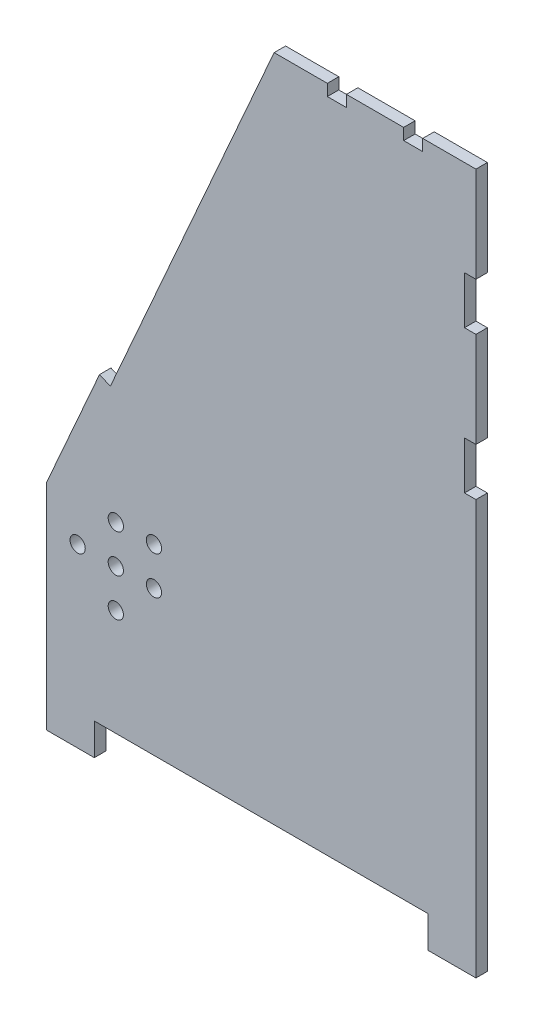
ISO-10303-21;
HEADER;
FILE_DESCRIPTION(('STEP AP214'),'2;1');
FILE_NAME('part.step','',(''),(''),'','','');
FILE_SCHEMA(('AUTOMOTIVE_DESIGN { 1 0 10303 214 1 1 1 1 }'));
ENDSEC;
DATA;
#1=APPLICATION_CONTEXT('core data for automotive mechanical design processes');
#2=APPLICATION_PROTOCOL_DEFINITION('international standard','automotive_design',2000,#1);
#3=PRODUCT_CONTEXT('',#1,'mechanical');
#4=PRODUCT('Part','Part','',(#3));
#5=PRODUCT_RELATED_PRODUCT_CATEGORY('part','',(#4));
#6=PRODUCT_DEFINITION_FORMATION('','',#4);
#7=PRODUCT_DEFINITION_CONTEXT('part definition',#1,'design');
#8=PRODUCT_DEFINITION('design','',#6,#7);
#9=PRODUCT_DEFINITION_SHAPE('','',#8);
#10=(LENGTH_UNIT() NAMED_UNIT(*) SI_UNIT(.MILLI.,.METRE.));
#11=(NAMED_UNIT(*) PLANE_ANGLE_UNIT() SI_UNIT($,.RADIAN.));
#12=(NAMED_UNIT(*) SI_UNIT($,.STERADIAN.) SOLID_ANGLE_UNIT());
#13=UNCERTAINTY_MEASURE_WITH_UNIT(LENGTH_MEASURE(1.E-05),#10,'distance_accuracy_value','');
#14=(GEOMETRIC_REPRESENTATION_CONTEXT(3) GLOBAL_UNCERTAINTY_ASSIGNED_CONTEXT((#13)) GLOBAL_UNIT_ASSIGNED_CONTEXT((#10,
#11,#12)) REPRESENTATION_CONTEXT('',''));
#15=CARTESIAN_POINT('',(0.,0.,0.));
#16=DIRECTION('',(0.,0.,1.));
#17=DIRECTION('',(1.,0.,0.));
#18=AXIS2_PLACEMENT_3D('',#15,#16,#17);
#19=CARTESIAN_POINT('',(-43.1964557488303,19.0826041733589,2.4));
#20=DIRECTION('',(-0.914719494610713,0.404089403695669,0.));
#21=DIRECTION('',(-0.404089403695669,-0.914719494610713,0.));
#22=AXIS2_PLACEMENT_3D('',#19,#20,#21);
#23=PLANE('',#22);
#24=DIRECTION('',(0.404089403695669,0.914719494610713,0.));
#25=VECTOR('',#24,1.);
#26=CARTESIAN_POINT('',(-43.1964557488303,19.0826041733589,0.));
#27=LINE('',#26,#25);
#28=CARTESIAN_POINT('',(-45.,15.,0.));
#29=VERTEX_POINT('',#28);
#30=CARTESIAN_POINT('',(-33.9067210494482,40.1113699652133,0.));
#31=VERTEX_POINT('',#30);
#32=EDGE_CURVE('E267',#29,#31,#27,.T.);
#33=ORIENTED_EDGE('',*,*,#32,.F.);
#34=DIRECTION('',(0.,0.,-1.));
#35=VECTOR('',#34,1.);
#36=CARTESIAN_POINT('',(-45.,15.,2.4));
#37=LINE('',#36,#35);
#38=CARTESIAN_POINT('',(-45.,15.,2.4));
#39=VERTEX_POINT('',#38);
#40=EDGE_CURVE('E11',#39,#29,#37,.T.);
#41=ORIENTED_EDGE('',*,*,#40,.F.);
#42=DIRECTION('',(0.404089403695669,0.914719494610713,0.));
#43=VECTOR('',#42,1.);
#44=CARTESIAN_POINT('',(-43.1964557488303,19.0826041733589,2.4));
#45=LINE('',#44,#43);
#46=CARTESIAN_POINT('',(-33.9067210494482,40.1113699652133,2.4));
#47=VERTEX_POINT('',#46);
#48=EDGE_CURVE('E409',#39,#47,#45,.T.);
#49=ORIENTED_EDGE('',*,*,#48,.T.);
#50=DIRECTION('',(0.,0.,-1.));
#51=VECTOR('',#50,1.);
#52=CARTESIAN_POINT('',(-33.9067210494482,40.1113699652133,2.4));
#53=LINE('',#52,#51);
#54=EDGE_CURVE('E146',#47,#31,#53,.T.);
#55=ORIENTED_EDGE('',*,*,#54,.T.);
#56=EDGE_LOOP('',(#33,#41,#49,#55));
#57=FACE_BOUND('',#56,.T.);
#58=ADVANCED_FACE('F37',(#57),#23,.T.);
#59=CARTESIAN_POINT('',(-45.,0.,2.4));
#60=DIRECTION('',(1.,0.,0.));
#61=DIRECTION('',(0.,1.,0.));
#62=AXIS2_PLACEMENT_3D('',#59,#60,#61);
#63=PLANE('',#62);
#64=DIRECTION('',(0.,-1.,0.));
#65=VECTOR('',#64,1.);
#66=CARTESIAN_POINT('',(-45.,0.,0.));
#67=LINE('',#66,#65);
#68=CARTESIAN_POINT('',(-45.,-30.,0.));
#69=VERTEX_POINT('',#68);
#70=EDGE_CURVE('E269',#29,#69,#67,.T.);
#71=ORIENTED_EDGE('',*,*,#70,.T.);
#72=DIRECTION('',(0.,0.,-1.));
#73=VECTOR('',#72,1.);
#74=CARTESIAN_POINT('',(-45.,-30.,2.4));
#75=LINE('',#74,#73);
#76=CARTESIAN_POINT('',(-45.,-30.,2.4));
#77=VERTEX_POINT('',#76);
#78=EDGE_CURVE('E46',#77,#69,#75,.T.);
#79=ORIENTED_EDGE('',*,*,#78,.F.);
#80=DIRECTION('',(0.,-1.,0.));
#81=VECTOR('',#80,1.);
#82=CARTESIAN_POINT('',(-45.,0.,2.4));
#83=LINE('',#82,#81);
#84=EDGE_CURVE('E406',#39,#77,#83,.T.);
#85=ORIENTED_EDGE('',*,*,#84,.F.);
#86=ORIENTED_EDGE('',*,*,#40,.T.);
#87=EDGE_LOOP('',(#71,#79,#85,#86));
#88=FACE_BOUND('',#87,.T.);
#89=ADVANCED_FACE('F394',(#88),#63,.F.);
#90=CARTESIAN_POINT('',(0.,-30.,2.4));
#91=DIRECTION('',(0.,-1.,0.));
#92=DIRECTION('',(1.,0.,0.));
#93=AXIS2_PLACEMENT_3D('',#90,#91,#92);
#94=PLANE('',#93);
#95=DIRECTION('',(-1.,0.,0.));
#96=VECTOR('',#95,1.);
#97=CARTESIAN_POINT('',(0.,-30.,0.));
#98=LINE('',#97,#96);
#99=CARTESIAN_POINT('',(-35.,-30.,0.));
#100=VERTEX_POINT('',#99);
#101=EDGE_CURVE('E272',#100,#69,#98,.T.);
#102=ORIENTED_EDGE('',*,*,#101,.F.);
#103=DIRECTION('',(0.,0.,-1.));
#104=VECTOR('',#103,1.);
#105=CARTESIAN_POINT('',(-35.,-30.,2.4));
#106=LINE('',#105,#104);
#107=CARTESIAN_POINT('',(-35.,-30.,2.4));
#108=VERTEX_POINT('',#107);
#109=EDGE_CURVE('E384',#108,#100,#106,.T.);
#110=ORIENTED_EDGE('',*,*,#109,.F.);
#111=DIRECTION('',(-1.,0.,0.));
#112=VECTOR('',#111,1.);
#113=CARTESIAN_POINT('',(0.,-30.,2.4));
#114=LINE('',#113,#112);
#115=EDGE_CURVE('E391',#108,#77,#114,.T.);
#116=ORIENTED_EDGE('',*,*,#115,.T.);
#117=ORIENTED_EDGE('',*,*,#78,.T.);
#118=EDGE_LOOP('',(#102,#110,#116,#117));
#119=FACE_BOUND('',#118,.T.);
#120=ADVANCED_FACE('F389',(#119),#94,.T.);
#121=CARTESIAN_POINT('',(-35.,0.,2.4));
#122=DIRECTION('',(-1.,0.,0.));
#123=DIRECTION('',(0.,-1.,0.));
#124=AXIS2_PLACEMENT_3D('',#121,#122,#123);
#125=PLANE('',#124);
#126=DIRECTION('',(0.,1.,0.));
#127=VECTOR('',#126,1.);
#128=CARTESIAN_POINT('',(-35.,0.,0.));
#129=LINE('',#128,#127);
#130=CARTESIAN_POINT('',(-35.,-23.3333333333333,0.));
#131=VERTEX_POINT('',#130);
#132=EDGE_CURVE('E275',#100,#131,#129,.T.);
#133=ORIENTED_EDGE('',*,*,#132,.T.);
#134=DIRECTION('',(0.,0.,-1.));
#135=VECTOR('',#134,1.);
#136=CARTESIAN_POINT('',(-35.,-23.3333333333333,2.4));
#137=LINE('',#136,#135);
#138=CARTESIAN_POINT('',(-35.,-23.3333333333333,2.4));
#139=VERTEX_POINT('',#138);
#140=EDGE_CURVE('E381',#139,#131,#137,.T.);
#141=ORIENTED_EDGE('',*,*,#140,.F.);
#142=DIRECTION('',(0.,1.,0.));
#143=VECTOR('',#142,1.);
#144=CARTESIAN_POINT('',(-35.,0.,2.4));
#145=LINE('',#144,#143);
#146=EDGE_CURVE('E402',#108,#139,#145,.T.);
#147=ORIENTED_EDGE('',*,*,#146,.F.);
#148=ORIENTED_EDGE('',*,*,#109,.T.);
#149=EDGE_LOOP('',(#133,#141,#147,#148));
#150=FACE_BOUND('',#149,.T.);
#151=ADVANCED_FACE('F399',(#150),#125,.F.);
#152=CARTESIAN_POINT('',(0.,-23.3333333333333,2.4));
#153=DIRECTION('',(0.,1.,0.));
#154=DIRECTION('',(0.,0.,1.));
#155=AXIS2_PLACEMENT_3D('',#152,#153,#154);
#156=PLANE('',#155);
#157=DIRECTION('',(1.,0.,0.));
#158=VECTOR('',#157,1.);
#159=CARTESIAN_POINT('',(0.,-23.3333333333333,0.));
#160=LINE('',#159,#158);
#161=CARTESIAN_POINT('',(35.,-23.3333333333333,0.));
#162=VERTEX_POINT('',#161);
#163=EDGE_CURVE('E279',#131,#162,#160,.T.);
#164=ORIENTED_EDGE('',*,*,#163,.T.);
#165=DIRECTION('',(0.,0.,-1.));
#166=VECTOR('',#165,1.);
#167=CARTESIAN_POINT('',(35.,-23.3333333333333,2.4));
#168=LINE('',#167,#166);
#169=CARTESIAN_POINT('',(35.,-23.3333333333333,2.4));
#170=VERTEX_POINT('',#169);
#171=EDGE_CURVE('E378',#170,#162,#168,.T.);
#172=ORIENTED_EDGE('',*,*,#171,.F.);
#173=DIRECTION('',(1.,0.,0.));
#174=VECTOR('',#173,1.);
#175=CARTESIAN_POINT('',(0.,-23.3333333333333,2.4));
#176=LINE('',#175,#174);
#177=EDGE_CURVE('E404',#139,#170,#176,.T.);
#178=ORIENTED_EDGE('',*,*,#177,.F.);
#179=ORIENTED_EDGE('',*,*,#140,.T.);
#180=EDGE_LOOP('',(#164,#172,#178,#179));
#181=FACE_BOUND('',#180,.T.);
#182=ADVANCED_FACE('F536',(#181),#156,.F.);
#183=CARTESIAN_POINT('',(35.,0.,2.4));
#184=DIRECTION('',(1.,0.,0.));
#185=DIRECTION('',(0.,0.,-1.));
#186=AXIS2_PLACEMENT_3D('',#183,#184,#185);
#187=PLANE('',#186);
#188=DIRECTION('',(0.,-1.,0.));
#189=VECTOR('',#188,1.);
#190=CARTESIAN_POINT('',(35.,0.,0.));
#191=LINE('',#190,#189);
#192=CARTESIAN_POINT('',(35.,-30.,0.));
#193=VERTEX_POINT('',#192);
#194=EDGE_CURVE('E282',#162,#193,#191,.T.);
#195=ORIENTED_EDGE('',*,*,#194,.T.);
#196=DIRECTION('',(0.,0.,-1.));
#197=VECTOR('',#196,1.);
#198=CARTESIAN_POINT('',(35.,-30.,2.4));
#199=LINE('',#198,#197);
#200=CARTESIAN_POINT('',(35.,-30.,2.4));
#201=VERTEX_POINT('',#200);
#202=EDGE_CURVE('E376',#201,#193,#199,.T.);
#203=ORIENTED_EDGE('',*,*,#202,.F.);
#204=DIRECTION('',(0.,-1.,0.));
#205=VECTOR('',#204,1.);
#206=CARTESIAN_POINT('',(35.,0.,2.4));
#207=LINE('',#206,#205);
#208=EDGE_CURVE('E413',#170,#201,#207,.T.);
#209=ORIENTED_EDGE('',*,*,#208,.F.);
#210=ORIENTED_EDGE('',*,*,#171,.T.);
#211=EDGE_LOOP('',(#195,#203,#209,#210));
#212=FACE_BOUND('',#211,.T.);
#213=ADVANCED_FACE('F533',(#212),#187,.F.);
#214=CARTESIAN_POINT('',(45.,-30.,0.));
#215=VERTEX_POINT('',#214);
#216=EDGE_CURVE('E276',#215,#193,#98,.T.);
#217=ORIENTED_EDGE('',*,*,#216,.F.);
#218=DIRECTION('',(0.,0.,-1.));
#219=VECTOR('',#218,1.);
#220=CARTESIAN_POINT('',(45.,-30.,2.4));
#221=LINE('',#220,#219);
#222=CARTESIAN_POINT('',(45.,-30.,2.4));
#223=VERTEX_POINT('',#222);
#224=EDGE_CURVE('E374',#223,#215,#221,.T.);
#225=ORIENTED_EDGE('',*,*,#224,.F.);
#226=EDGE_CURVE('E408',#223,#201,#114,.T.);
#227=ORIENTED_EDGE('',*,*,#226,.T.);
#228=ORIENTED_EDGE('',*,*,#202,.T.);
#229=EDGE_LOOP('',(#217,#225,#227,#228));
#230=FACE_BOUND('',#229,.T.);
#231=ADVANCED_FACE('F531',(#230),#94,.T.);
#232=CARTESIAN_POINT('',(45.,0.,2.4));
#233=DIRECTION('',(1.,0.,0.));
#234=DIRECTION('',(0.,0.,-1.));
#235=AXIS2_PLACEMENT_3D('',#232,#233,#234);
#236=PLANE('',#235);
#237=DIRECTION('',(0.,-1.,0.));
#238=VECTOR('',#237,1.);
#239=CARTESIAN_POINT('',(45.,0.,0.));
#240=LINE('',#239,#238);
#241=CARTESIAN_POINT('',(45.,56.8645301782836,0.));
#242=VERTEX_POINT('',#241);
#243=EDGE_CURVE('E285',#242,#215,#240,.T.);
#244=ORIENTED_EDGE('',*,*,#243,.F.);
#245=DIRECTION('',(0.,0.,-1.));
#246=VECTOR('',#245,1.);
#247=CARTESIAN_POINT('',(45.,56.8645301782836,2.4));
#248=LINE('',#247,#246);
#249=CARTESIAN_POINT('',(45.,56.8645301782836,2.4));
#250=VERTEX_POINT('',#249);
#251=EDGE_CURVE('E372',#250,#242,#248,.T.);
#252=ORIENTED_EDGE('',*,*,#251,.F.);
#253=DIRECTION('',(0.,-1.,0.));
#254=VECTOR('',#253,1.);
#255=CARTESIAN_POINT('',(45.,0.,2.4));
#256=LINE('',#255,#254);
#257=EDGE_CURVE('E412',#250,#223,#256,.T.);
#258=ORIENTED_EDGE('',*,*,#257,.T.);
#259=ORIENTED_EDGE('',*,*,#224,.T.);
#260=EDGE_LOOP('',(#244,#252,#258,#259));
#261=FACE_BOUND('',#260,.T.);
#262=ADVANCED_FACE('F529',(#261),#236,.T.);
#263=CARTESIAN_POINT('',(0.,56.8645301782836,2.4));
#264=DIRECTION('',(0.,1.,0.));
#265=DIRECTION('',(0.,0.,1.));
#266=AXIS2_PLACEMENT_3D('',#263,#264,#265);
#267=PLANE('',#266);
#268=DIRECTION('',(1.,0.,0.));
#269=VECTOR('',#268,1.);
#270=CARTESIAN_POINT('',(0.,56.8645301782836,0.));
#271=LINE('',#270,#269);
#272=CARTESIAN_POINT('',(42.6,56.8645301782836,0.));
#273=VERTEX_POINT('',#272);
#274=EDGE_CURVE('E288',#273,#242,#271,.T.);
#275=ORIENTED_EDGE('',*,*,#274,.F.);
#276=DIRECTION('',(0.,0.,-1.));
#277=VECTOR('',#276,1.);
#278=CARTESIAN_POINT('',(42.6,56.8645301782836,2.4));
#279=LINE('',#278,#277);
#280=CARTESIAN_POINT('',(42.6,56.8645301782836,2.4));
#281=VERTEX_POINT('',#280);
#282=EDGE_CURVE('E370',#281,#273,#279,.T.);
#283=ORIENTED_EDGE('',*,*,#282,.F.);
#284=DIRECTION('',(1.,0.,0.));
#285=VECTOR('',#284,1.);
#286=CARTESIAN_POINT('',(0.,56.8645301782836,2.4));
#287=LINE('',#286,#285);
#288=EDGE_CURVE('E417',#281,#250,#287,.T.);
#289=ORIENTED_EDGE('',*,*,#288,.T.);
#290=ORIENTED_EDGE('',*,*,#251,.T.);
#291=EDGE_LOOP('',(#275,#283,#289,#290));
#292=FACE_BOUND('',#291,.T.);
#293=ADVANCED_FACE('F524',(#292),#267,.T.);
#294=CARTESIAN_POINT('',(42.6,0.,2.4));
#295=DIRECTION('',(1.,0.,0.));
#296=DIRECTION('',(0.,0.,-1.));
#297=AXIS2_PLACEMENT_3D('',#294,#295,#296);
#298=PLANE('',#297);
#299=DIRECTION('',(0.,-1.,0.));
#300=VECTOR('',#299,1.);
#301=CARTESIAN_POINT('',(42.6,0.,0.));
#302=LINE('',#301,#300);
#303=CARTESIAN_POINT('',(42.6,66.8645301782836,0.));
#304=VERTEX_POINT('',#303);
#305=EDGE_CURVE('E291',#304,#273,#302,.T.);
#306=ORIENTED_EDGE('',*,*,#305,.F.);
#307=DIRECTION('',(0.,0.,-1.));
#308=VECTOR('',#307,1.);
#309=CARTESIAN_POINT('',(42.6,66.8645301782836,2.4));
#310=LINE('',#309,#308);
#311=CARTESIAN_POINT('',(42.6,66.8645301782836,2.4));
#312=VERTEX_POINT('',#311);
#313=EDGE_CURVE('E368',#312,#304,#310,.T.);
#314=ORIENTED_EDGE('',*,*,#313,.F.);
#315=DIRECTION('',(0.,-1.,0.));
#316=VECTOR('',#315,1.);
#317=CARTESIAN_POINT('',(42.6,0.,2.4));
#318=LINE('',#317,#316);
#319=EDGE_CURVE('E425',#312,#281,#318,.T.);
#320=ORIENTED_EDGE('',*,*,#319,.T.);
#321=ORIENTED_EDGE('',*,*,#282,.T.);
#322=EDGE_LOOP('',(#306,#314,#320,#321));
#323=FACE_BOUND('',#322,.T.);
#324=ADVANCED_FACE('F520',(#323),#298,.T.);
#325=CARTESIAN_POINT('',(0.,66.8645301782836,2.4));
#326=DIRECTION('',(0.,-1.,0.));
#327=DIRECTION('',(0.,0.,-1.));
#328=AXIS2_PLACEMENT_3D('',#325,#326,#327);
#329=PLANE('',#328);
#330=DIRECTION('',(-1.,0.,0.));
#331=VECTOR('',#330,1.);
#332=CARTESIAN_POINT('',(0.,66.8645301782836,0.));
#333=LINE('',#332,#331);
#334=CARTESIAN_POINT('',(45.,66.8645301782836,0.));
#335=VERTEX_POINT('',#334);
#336=EDGE_CURVE('E294',#335,#304,#333,.T.);
#337=ORIENTED_EDGE('',*,*,#336,.F.);
#338=DIRECTION('',(0.,0.,-1.));
#339=VECTOR('',#338,1.);
#340=CARTESIAN_POINT('',(45.,66.8645301782836,2.4));
#341=LINE('',#340,#339);
#342=CARTESIAN_POINT('',(45.,66.8645301782836,2.4));
#343=VERTEX_POINT('',#342);
#344=EDGE_CURVE('E366',#343,#335,#341,.T.);
#345=ORIENTED_EDGE('',*,*,#344,.F.);
#346=DIRECTION('',(-1.,0.,0.));
#347=VECTOR('',#346,1.);
#348=CARTESIAN_POINT('',(0.,66.8645301782836,2.4));
#349=LINE('',#348,#347);
#350=EDGE_CURVE('E428',#343,#312,#349,.T.);
#351=ORIENTED_EDGE('',*,*,#350,.T.);
#352=ORIENTED_EDGE('',*,*,#313,.T.);
#353=EDGE_LOOP('',(#337,#345,#351,#352));
#354=FACE_BOUND('',#353,.T.);
#355=ADVANCED_FACE('F516',(#354),#329,.T.);
#356=CARTESIAN_POINT('',(45.,0.,2.4));
#357=DIRECTION('',(1.,0.,0.));
#358=DIRECTION('',(0.,0.,-1.));
#359=AXIS2_PLACEMENT_3D('',#356,#357,#358);
#360=PLANE('',#359);
#361=DIRECTION('',(0.,-1.,0.));
#362=VECTOR('',#361,1.);
#363=CARTESIAN_POINT('',(45.,0.,0.));
#364=LINE('',#363,#362);
#365=CARTESIAN_POINT('',(45.,86.8645301782836,0.));
#366=VERTEX_POINT('',#365);
#367=EDGE_CURVE('E297',#366,#335,#364,.T.);
#368=ORIENTED_EDGE('',*,*,#367,.F.);
#369=DIRECTION('',(0.,0.,-1.));
#370=VECTOR('',#369,1.);
#371=CARTESIAN_POINT('',(45.,86.8645301782836,2.4));
#372=LINE('',#371,#370);
#373=CARTESIAN_POINT('',(45.,86.8645301782836,2.4));
#374=VERTEX_POINT('',#373);
#375=EDGE_CURVE('E364',#374,#366,#372,.T.);
#376=ORIENTED_EDGE('',*,*,#375,.F.);
#377=DIRECTION('',(0.,-1.,0.));
#378=VECTOR('',#377,1.);
#379=CARTESIAN_POINT('',(45.,0.,2.4));
#380=LINE('',#379,#378);
#381=EDGE_CURVE('E431',#374,#343,#380,.T.);
#382=ORIENTED_EDGE('',*,*,#381,.T.);
#383=ORIENTED_EDGE('',*,*,#344,.T.);
#384=EDGE_LOOP('',(#368,#376,#382,#383));
#385=FACE_BOUND('',#384,.T.);
#386=ADVANCED_FACE('F512',(#385),#360,.T.);
#387=CARTESIAN_POINT('',(0.,86.8645301782836,2.4));
#388=DIRECTION('',(0.,1.,0.));
#389=DIRECTION('',(0.,0.,1.));
#390=AXIS2_PLACEMENT_3D('',#387,#388,#389);
#391=PLANE('',#390);
#392=DIRECTION('',(1.,0.,0.));
#393=VECTOR('',#392,1.);
#394=CARTESIAN_POINT('',(0.,86.8645301782836,0.));
#395=LINE('',#394,#393);
#396=CARTESIAN_POINT('',(42.6,86.8645301782836,0.));
#397=VERTEX_POINT('',#396);
#398=EDGE_CURVE('E300',#397,#366,#395,.T.);
#399=ORIENTED_EDGE('',*,*,#398,.F.);
#400=DIRECTION('',(0.,0.,-1.));
#401=VECTOR('',#400,1.);
#402=CARTESIAN_POINT('',(42.6,86.8645301782836,2.4));
#403=LINE('',#402,#401);
#404=CARTESIAN_POINT('',(42.6,86.8645301782836,2.4));
#405=VERTEX_POINT('',#404);
#406=EDGE_CURVE('E362',#405,#397,#403,.T.);
#407=ORIENTED_EDGE('',*,*,#406,.F.);
#408=DIRECTION('',(1.,0.,0.));
#409=VECTOR('',#408,1.);
#410=CARTESIAN_POINT('',(0.,86.8645301782836,2.4));
#411=LINE('',#410,#409);
#412=EDGE_CURVE('E434',#405,#374,#411,.T.);
#413=ORIENTED_EDGE('',*,*,#412,.T.);
#414=ORIENTED_EDGE('',*,*,#375,.T.);
#415=EDGE_LOOP('',(#399,#407,#413,#414));
#416=FACE_BOUND('',#415,.T.);
#417=ADVANCED_FACE('F508',(#416),#391,.T.);
#418=CARTESIAN_POINT('',(42.6,0.,2.4));
#419=DIRECTION('',(1.,0.,0.));
#420=DIRECTION('',(0.,0.,-1.));
#421=AXIS2_PLACEMENT_3D('',#418,#419,#420);
#422=PLANE('',#421);
#423=DIRECTION('',(0.,-1.,0.));
#424=VECTOR('',#423,1.);
#425=CARTESIAN_POINT('',(42.6,0.,0.));
#426=LINE('',#425,#424);
#427=CARTESIAN_POINT('',(42.6,96.8645301782836,0.));
#428=VERTEX_POINT('',#427);
#429=EDGE_CURVE('E304',#428,#397,#426,.T.);
#430=ORIENTED_EDGE('',*,*,#429,.F.);
#431=DIRECTION('',(0.,0.,-1.));
#432=VECTOR('',#431,1.);
#433=CARTESIAN_POINT('',(42.6,96.8645301782836,2.4));
#434=LINE('',#433,#432);
#435=CARTESIAN_POINT('',(42.6,96.8645301782836,2.4));
#436=VERTEX_POINT('',#435);
#437=EDGE_CURVE('E360',#436,#428,#434,.T.);
#438=ORIENTED_EDGE('',*,*,#437,.F.);
#439=DIRECTION('',(0.,-1.,0.));
#440=VECTOR('',#439,1.);
#441=CARTESIAN_POINT('',(42.6,0.,2.4));
#442=LINE('',#441,#440);
#443=EDGE_CURVE('E438',#436,#405,#442,.T.);
#444=ORIENTED_EDGE('',*,*,#443,.T.);
#445=ORIENTED_EDGE('',*,*,#406,.T.);
#446=EDGE_LOOP('',(#430,#438,#444,#445));
#447=FACE_BOUND('',#446,.T.);
#448=ADVANCED_FACE('F504',(#447),#422,.T.);
#449=CARTESIAN_POINT('',(0.,96.8645301782836,2.4));
#450=DIRECTION('',(0.,-1.,0.));
#451=DIRECTION('',(0.,0.,-1.));
#452=AXIS2_PLACEMENT_3D('',#449,#450,#451);
#453=PLANE('',#452);
#454=DIRECTION('',(-1.,0.,0.));
#455=VECTOR('',#454,1.);
#456=CARTESIAN_POINT('',(0.,96.8645301782836,0.));
#457=LINE('',#456,#455);
#458=CARTESIAN_POINT('',(45.,96.8645301782836,0.));
#459=VERTEX_POINT('',#458);
#460=EDGE_CURVE('E307',#459,#428,#457,.T.);
#461=ORIENTED_EDGE('',*,*,#460,.F.);
#462=DIRECTION('',(0.,0.,-1.));
#463=VECTOR('',#462,1.);
#464=CARTESIAN_POINT('',(45.,96.8645301782836,2.4));
#465=LINE('',#464,#463);
#466=CARTESIAN_POINT('',(45.,96.8645301782836,2.4));
#467=VERTEX_POINT('',#466);
#468=EDGE_CURVE('E358',#467,#459,#465,.T.);
#469=ORIENTED_EDGE('',*,*,#468,.F.);
#470=DIRECTION('',(-1.,0.,0.));
#471=VECTOR('',#470,1.);
#472=CARTESIAN_POINT('',(0.,96.8645301782836,2.4));
#473=LINE('',#472,#471);
#474=EDGE_CURVE('E441',#467,#436,#473,.T.);
#475=ORIENTED_EDGE('',*,*,#474,.T.);
#476=ORIENTED_EDGE('',*,*,#437,.T.);
#477=EDGE_LOOP('',(#461,#469,#475,#476));
#478=FACE_BOUND('',#477,.T.);
#479=ADVANCED_FACE('F500',(#478),#453,.T.);
#480=CARTESIAN_POINT('',(45.,116.864530178284,0.));
#481=VERTEX_POINT('',#480);
#482=EDGE_CURVE('E301',#481,#459,#364,.T.);
#483=ORIENTED_EDGE('',*,*,#482,.F.);
#484=DIRECTION('',(0.,0.,-1.));
#485=VECTOR('',#484,1.);
#486=CARTESIAN_POINT('',(45.,116.864530178284,2.4));
#487=LINE('',#486,#485);
#488=CARTESIAN_POINT('',(45.,116.864530178284,2.4));
#489=VERTEX_POINT('',#488);
#490=EDGE_CURVE('E356',#489,#481,#487,.T.);
#491=ORIENTED_EDGE('',*,*,#490,.F.);
#492=EDGE_CURVE('E435',#489,#467,#380,.T.);
#493=ORIENTED_EDGE('',*,*,#492,.T.);
#494=ORIENTED_EDGE('',*,*,#468,.T.);
#495=EDGE_LOOP('',(#483,#491,#493,#494));
#496=FACE_BOUND('',#495,.T.);
#497=ADVANCED_FACE('F496',(#496),#360,.T.);
#498=CARTESIAN_POINT('',(0.,116.864530178284,2.4));
#499=DIRECTION('',(0.,1.,0.));
#500=DIRECTION('',(0.,0.,1.));
#501=AXIS2_PLACEMENT_3D('',#498,#499,#500);
#502=PLANE('',#501);
#503=DIRECTION('',(1.,0.,0.));
#504=VECTOR('',#503,1.);
#505=CARTESIAN_POINT('',(0.,116.864530178284,0.));
#506=LINE('',#505,#504);
#507=CARTESIAN_POINT('',(33.85,116.864530178284,0.));
#508=VERTEX_POINT('',#507);
#509=EDGE_CURVE('E310',#508,#481,#506,.T.);
#510=ORIENTED_EDGE('',*,*,#509,.F.);
#511=DIRECTION('',(0.,0.,-1.));
#512=VECTOR('',#511,1.);
#513=CARTESIAN_POINT('',(33.85,116.864530178284,2.4));
#514=LINE('',#513,#512);
#515=CARTESIAN_POINT('',(33.85,116.864530178284,2.4));
#516=VERTEX_POINT('',#515);
#517=EDGE_CURVE('E354',#516,#508,#514,.T.);
#518=ORIENTED_EDGE('',*,*,#517,.F.);
#519=DIRECTION('',(1.,0.,0.));
#520=VECTOR('',#519,1.);
#521=CARTESIAN_POINT('',(0.,116.864530178284,2.4));
#522=LINE('',#521,#520);
#523=EDGE_CURVE('E444',#516,#489,#522,.T.);
#524=ORIENTED_EDGE('',*,*,#523,.T.);
#525=ORIENTED_EDGE('',*,*,#490,.T.);
#526=EDGE_LOOP('',(#510,#518,#524,#525));
#527=FACE_BOUND('',#526,.T.);
#528=ADVANCED_FACE('F491',(#527),#502,.T.);
#529=CARTESIAN_POINT('',(33.85,0.,2.4));
#530=DIRECTION('',(-1.,0.,0.));
#531=DIRECTION('',(0.,0.,1.));
#532=AXIS2_PLACEMENT_3D('',#529,#530,#531);
#533=PLANE('',#532);
#534=DIRECTION('',(0.,1.,0.));
#535=VECTOR('',#534,1.);
#536=CARTESIAN_POINT('',(33.85,0.,0.));
#537=LINE('',#536,#535);
#538=CARTESIAN_POINT('',(33.85,114.464530178284,0.));
#539=VERTEX_POINT('',#538);
#540=EDGE_CURVE('E313',#539,#508,#537,.T.);
#541=ORIENTED_EDGE('',*,*,#540,.F.);
#542=DIRECTION('',(0.,0.,-1.));
#543=VECTOR('',#542,1.);
#544=CARTESIAN_POINT('',(33.85,114.464530178284,2.4));
#545=LINE('',#544,#543);
#546=CARTESIAN_POINT('',(33.85,114.464530178284,2.4));
#547=VERTEX_POINT('',#546);
#548=EDGE_CURVE('E352',#547,#539,#545,.T.);
#549=ORIENTED_EDGE('',*,*,#548,.F.);
#550=DIRECTION('',(0.,1.,0.));
#551=VECTOR('',#550,1.);
#552=CARTESIAN_POINT('',(33.85,0.,2.4));
#553=LINE('',#552,#551);
#554=EDGE_CURVE('E447',#547,#516,#553,.T.);
#555=ORIENTED_EDGE('',*,*,#554,.T.);
#556=ORIENTED_EDGE('',*,*,#517,.T.);
#557=EDGE_LOOP('',(#541,#549,#555,#556));
#558=FACE_BOUND('',#557,.T.);
#559=ADVANCED_FACE('F486',(#558),#533,.T.);
#560=CARTESIAN_POINT('',(0.,114.464530178284,2.4));
#561=DIRECTION('',(0.,1.,0.));
#562=DIRECTION('',(0.,0.,1.));
#563=AXIS2_PLACEMENT_3D('',#560,#561,#562);
#564=PLANE('',#563);
#565=DIRECTION('',(1.,0.,0.));
#566=VECTOR('',#565,1.);
#567=CARTESIAN_POINT('',(0.,114.464530178284,0.));
#568=LINE('',#567,#566);
#569=CARTESIAN_POINT('',(29.85,114.464530178284,0.));
#570=VERTEX_POINT('',#569);
#571=EDGE_CURVE('E317',#570,#539,#568,.T.);
#572=ORIENTED_EDGE('',*,*,#571,.F.);
#573=DIRECTION('',(0.,0.,-1.));
#574=VECTOR('',#573,1.);
#575=CARTESIAN_POINT('',(29.85,114.464530178284,2.4));
#576=LINE('',#575,#574);
#577=CARTESIAN_POINT('',(29.85,114.464530178284,2.4));
#578=VERTEX_POINT('',#577);
#579=EDGE_CURVE('E350',#578,#570,#576,.T.);
#580=ORIENTED_EDGE('',*,*,#579,.F.);
#581=DIRECTION('',(1.,0.,0.));
#582=VECTOR('',#581,1.);
#583=CARTESIAN_POINT('',(0.,114.464530178284,2.4));
#584=LINE('',#583,#582);
#585=EDGE_CURVE('E451',#578,#547,#584,.T.);
#586=ORIENTED_EDGE('',*,*,#585,.T.);
#587=ORIENTED_EDGE('',*,*,#548,.T.);
#588=EDGE_LOOP('',(#572,#580,#586,#587));
#589=FACE_BOUND('',#588,.T.);
#590=ADVANCED_FACE('F482',(#589),#564,.T.);
#591=CARTESIAN_POINT('',(29.85,0.,2.4));
#592=DIRECTION('',(1.,0.,0.));
#593=DIRECTION('',(0.,0.,-1.));
#594=AXIS2_PLACEMENT_3D('',#591,#592,#593);
#595=PLANE('',#594);
#596=DIRECTION('',(0.,-1.,0.));
#597=VECTOR('',#596,1.);
#598=CARTESIAN_POINT('',(29.85,0.,0.));
#599=LINE('',#598,#597);
#600=CARTESIAN_POINT('',(29.85,116.864530178284,0.));
#601=VERTEX_POINT('',#600);
#602=EDGE_CURVE('E320',#601,#570,#599,.T.);
#603=ORIENTED_EDGE('',*,*,#602,.F.);
#604=DIRECTION('',(0.,0.,-1.));
#605=VECTOR('',#604,1.);
#606=CARTESIAN_POINT('',(29.85,116.864530178284,2.4));
#607=LINE('',#606,#605);
#608=CARTESIAN_POINT('',(29.85,116.864530178284,2.4));
#609=VERTEX_POINT('',#608);
#610=EDGE_CURVE('E348',#609,#601,#607,.T.);
#611=ORIENTED_EDGE('',*,*,#610,.F.);
#612=DIRECTION('',(0.,-1.,0.));
#613=VECTOR('',#612,1.);
#614=CARTESIAN_POINT('',(29.85,0.,2.4));
#615=LINE('',#614,#613);
#616=EDGE_CURVE('E454',#609,#578,#615,.T.);
#617=ORIENTED_EDGE('',*,*,#616,.T.);
#618=ORIENTED_EDGE('',*,*,#579,.T.);
#619=EDGE_LOOP('',(#603,#611,#617,#618));
#620=FACE_BOUND('',#619,.T.);
#621=ADVANCED_FACE('F478',(#620),#595,.T.);
#622=CARTESIAN_POINT('',(17.85,116.864530178284,0.));
#623=VERTEX_POINT('',#622);
#624=EDGE_CURVE('E314',#623,#601,#506,.T.);
#625=ORIENTED_EDGE('',*,*,#624,.F.);
#626=DIRECTION('',(0.,0.,-1.));
#627=VECTOR('',#626,1.);
#628=CARTESIAN_POINT('',(17.85,116.864530178284,2.4));
#629=LINE('',#628,#627);
#630=CARTESIAN_POINT('',(17.85,116.864530178284,2.4));
#631=VERTEX_POINT('',#630);
#632=EDGE_CURVE('E346',#631,#623,#629,.T.);
#633=ORIENTED_EDGE('',*,*,#632,.F.);
#634=EDGE_CURVE('E448',#631,#609,#522,.T.);
#635=ORIENTED_EDGE('',*,*,#634,.T.);
#636=ORIENTED_EDGE('',*,*,#610,.T.);
#637=EDGE_LOOP('',(#625,#633,#635,#636));
#638=FACE_BOUND('',#637,.T.);
#639=ADVANCED_FACE('F474',(#638),#502,.T.);
#640=CARTESIAN_POINT('',(17.85,0.,2.4));
#641=DIRECTION('',(1.,0.,0.));
#642=DIRECTION('',(0.,0.,-1.));
#643=AXIS2_PLACEMENT_3D('',#640,#641,#642);
#644=PLANE('',#643);
#645=DIRECTION('',(0.,-1.,0.));
#646=VECTOR('',#645,1.);
#647=CARTESIAN_POINT('',(17.85,0.,0.));
#648=LINE('',#647,#646);
#649=CARTESIAN_POINT('',(17.85,114.464530178284,0.));
#650=VERTEX_POINT('',#649);
#651=EDGE_CURVE('E323',#623,#650,#648,.T.);
#652=ORIENTED_EDGE('',*,*,#651,.T.);
#653=DIRECTION('',(0.,0.,-1.));
#654=VECTOR('',#653,1.);
#655=CARTESIAN_POINT('',(17.85,114.464530178284,2.4));
#656=LINE('',#655,#654);
#657=CARTESIAN_POINT('',(17.85,114.464530178284,2.4));
#658=VERTEX_POINT('',#657);
#659=EDGE_CURVE('E343',#658,#650,#656,.T.);
#660=ORIENTED_EDGE('',*,*,#659,.F.);
#661=DIRECTION('',(0.,-1.,0.));
#662=VECTOR('',#661,1.);
#663=CARTESIAN_POINT('',(17.85,0.,2.4));
#664=LINE('',#663,#662);
#665=EDGE_CURVE('E457',#631,#658,#664,.T.);
#666=ORIENTED_EDGE('',*,*,#665,.F.);
#667=ORIENTED_EDGE('',*,*,#632,.T.);
#668=EDGE_LOOP('',(#652,#660,#666,#667));
#669=FACE_BOUND('',#668,.T.);
#670=ADVANCED_FACE('F471',(#669),#644,.F.);
#671=CARTESIAN_POINT('',(0.,114.464530178284,2.4));
#672=DIRECTION('',(0.,-1.,0.));
#673=DIRECTION('',(0.,0.,-1.));
#674=AXIS2_PLACEMENT_3D('',#671,#672,#673);
#675=PLANE('',#674);
#676=DIRECTION('',(-1.,0.,0.));
#677=VECTOR('',#676,1.);
#678=CARTESIAN_POINT('',(0.,114.464530178284,0.));
#679=LINE('',#678,#677);
#680=CARTESIAN_POINT('',(13.85,114.464530178284,0.));
#681=VERTEX_POINT('',#680);
#682=EDGE_CURVE('E326',#650,#681,#679,.T.);
#683=ORIENTED_EDGE('',*,*,#682,.T.);
#684=DIRECTION('',(0.,0.,-1.));
#685=VECTOR('',#684,1.);
#686=CARTESIAN_POINT('',(13.85,114.464530178284,2.4));
#687=LINE('',#686,#685);
#688=CARTESIAN_POINT('',(13.85,114.464530178284,2.4));
#689=VERTEX_POINT('',#688);
#690=EDGE_CURVE('E340',#689,#681,#687,.T.);
#691=ORIENTED_EDGE('',*,*,#690,.F.);
#692=DIRECTION('',(-1.,0.,0.));
#693=VECTOR('',#692,1.);
#694=CARTESIAN_POINT('',(0.,114.464530178284,2.4));
#695=LINE('',#694,#693);
#696=EDGE_CURVE('E244',#658,#689,#695,.T.);
#697=ORIENTED_EDGE('',*,*,#696,.F.);
#698=ORIENTED_EDGE('',*,*,#659,.T.);
#699=EDGE_LOOP('',(#683,#691,#697,#698));
#700=FACE_BOUND('',#699,.T.);
#701=ADVANCED_FACE('F464',(#700),#675,.F.);
#702=CARTESIAN_POINT('',(13.85,0.,2.4));
#703=DIRECTION('',(-1.,0.,0.));
#704=DIRECTION('',(0.,0.,1.));
#705=AXIS2_PLACEMENT_3D('',#702,#703,#704);
#706=PLANE('',#705);
#707=DIRECTION('',(0.,1.,0.));
#708=VECTOR('',#707,1.);
#709=CARTESIAN_POINT('',(13.85,0.,0.));
#710=LINE('',#709,#708);
#711=CARTESIAN_POINT('',(13.85,116.864530178284,0.));
#712=VERTEX_POINT('',#711);
#713=EDGE_CURVE('E329',#681,#712,#710,.T.);
#714=ORIENTED_EDGE('',*,*,#713,.T.);
#715=DIRECTION('',(0.,0.,-1.));
#716=VECTOR('',#715,1.);
#717=CARTESIAN_POINT('',(13.85,116.864530178284,2.4));
#718=LINE('',#717,#716);
#719=CARTESIAN_POINT('',(13.85,116.864530178284,2.4));
#720=VERTEX_POINT('',#719);
#721=EDGE_CURVE('E232',#720,#712,#718,.T.);
#722=ORIENTED_EDGE('',*,*,#721,.F.);
#723=DIRECTION('',(0.,1.,0.));
#724=VECTOR('',#723,1.);
#725=CARTESIAN_POINT('',(13.85,0.,2.4));
#726=LINE('',#725,#724);
#727=EDGE_CURVE('E241',#689,#720,#726,.T.);
#728=ORIENTED_EDGE('',*,*,#727,.F.);
#729=ORIENTED_EDGE('',*,*,#690,.T.);
#730=EDGE_LOOP('',(#714,#722,#728,#729));
#731=FACE_BOUND('',#730,.T.);
#732=ADVANCED_FACE('F466',(#731),#706,.F.);
#733=CARTESIAN_POINT('',(0.,116.864530178284,2.4));
#734=DIRECTION('',(0.,1.,0.));
#735=DIRECTION('',(0.,0.,1.));
#736=AXIS2_PLACEMENT_3D('',#733,#734,#735);
#737=PLANE('',#736);
#738=DIRECTION('',(1.,0.,0.));
#739=VECTOR('',#738,1.);
#740=CARTESIAN_POINT('',(0.,116.864530178284,0.));
#741=LINE('',#740,#739);
#742=CARTESIAN_POINT('',(2.7,116.864530178284,0.));
#743=VERTEX_POINT('',#742);
#744=EDGE_CURVE('E229',#743,#712,#741,.T.);
#745=ORIENTED_EDGE('',*,*,#744,.F.);
#746=DIRECTION('',(0.,0.,-1.));
#747=VECTOR('',#746,1.);
#748=CARTESIAN_POINT('',(2.7,116.864530178284,2.4));
#749=LINE('',#748,#747);
#750=CARTESIAN_POINT('',(2.7,116.864530178284,2.4));
#751=VERTEX_POINT('',#750);
#752=EDGE_CURVE('E223',#751,#743,#749,.T.);
#753=ORIENTED_EDGE('',*,*,#752,.F.);
#754=DIRECTION('',(1.,0.,0.));
#755=VECTOR('',#754,1.);
#756=CARTESIAN_POINT('',(0.,116.864530178284,2.4));
#757=LINE('',#756,#755);
#758=EDGE_CURVE('E227',#751,#720,#757,.T.);
#759=ORIENTED_EDGE('',*,*,#758,.T.);
#760=ORIENTED_EDGE('',*,*,#721,.T.);
#761=EDGE_LOOP('',(#745,#753,#759,#760));
#762=FACE_BOUND('',#761,.T.);
#763=ADVANCED_FACE('F225',(#762),#737,.T.);
#764=CARTESIAN_POINT('',(-40.9373340135139,18.0846073445186,2.4));
#765=DIRECTION('',(0.914719494610713,-0.404089403695669,0.));
#766=DIRECTION('',(0.404089403695669,0.914719494610713,0.));
#767=AXIS2_PLACEMENT_3D('',#764,#765,#766);
#768=PLANE('',#767);
#769=DIRECTION('',(-0.404089403695669,-0.914719494610713,0.));
#770=VECTOR('',#769,1.);
#771=CARTESIAN_POINT('',(-40.9373340135139,18.0846073445186,0.));
#772=LINE('',#771,#770);
#773=CARTESIAN_POINT('',(-31.6475993141319,39.113373136373,0.));
#774=VERTEX_POINT('',#773);
#775=EDGE_CURVE('E333',#743,#774,#772,.T.);
#776=ORIENTED_EDGE('',*,*,#775,.T.);
#777=DIRECTION('',(0.,0.,-1.));
#778=VECTOR('',#777,1.);
#779=CARTESIAN_POINT('',(-31.6475993141319,39.113373136373,2.4));
#780=LINE('',#779,#778);
#781=CARTESIAN_POINT('',(-31.6475993141319,39.113373136373,2.4));
#782=VERTEX_POINT('',#781);
#783=EDGE_CURVE('E233',#782,#774,#780,.T.);
#784=ORIENTED_EDGE('',*,*,#783,.F.);
#785=DIRECTION('',(-0.404089403695669,-0.914719494610713,0.));
#786=VECTOR('',#785,1.);
#787=CARTESIAN_POINT('',(-40.9373340135139,18.0846073445186,2.4));
#788=LINE('',#787,#786);
#789=EDGE_CURVE('E236',#751,#782,#788,.T.);
#790=ORIENTED_EDGE('',*,*,#789,.F.);
#791=ORIENTED_EDGE('',*,*,#752,.T.);
#792=EDGE_LOOP('',(#776,#784,#790,#791));
#793=FACE_BOUND('',#792,.T.);
#794=ADVANCED_FACE('F237',(#793),#768,.F.);
#795=CARTESIAN_POINT('',(-22.5,15.,2.4));
#796=DIRECTION('',(0.,0.,-1.));
#797=DIRECTION('',(-1.,0.,0.));
#798=AXIS2_PLACEMENT_3D('',#795,#796,#797);
#799=CYLINDRICAL_SURFACE('',#798,1.6);
#800=CARTESIAN_POINT('',(-22.5,15.,2.4));
#801=DIRECTION('',(0.,0.,1.));
#802=DIRECTION('',(1.,0.,0.));
#803=AXIS2_PLACEMENT_3D('',#800,#801,#802);
#804=CIRCLE('',#803,1.6);
#805=CARTESIAN_POINT('',(-20.9,15.,2.4));
#806=VERTEX_POINT('',#805);
#807=EDGE_CURVE('E902',#806,#806,#804,.T.);
#808=ORIENTED_EDGE('',*,*,#807,.T.);
#809=EDGE_LOOP('',(#808));
#810=FACE_BOUND('',#809,.T.);
#811=CARTESIAN_POINT('',(-22.5,15.,0.));
#812=DIRECTION('',(0.,0.,1.));
#813=DIRECTION('',(1.,0.,0.));
#814=AXIS2_PLACEMENT_3D('',#811,#812,#813);
#815=CIRCLE('',#814,1.6);
#816=CARTESIAN_POINT('',(-20.9,15.,0.));
#817=VERTEX_POINT('',#816);
#818=EDGE_CURVE('E264',#817,#817,#815,.T.);
#819=ORIENTED_EDGE('',*,*,#818,.F.);
#820=EDGE_LOOP('',(#819));
#821=FACE_BOUND('',#820,.T.);
#822=ADVANCED_FACE('F552',(#810,#821),#799,.F.);
#823=CARTESIAN_POINT('',(-30.5,15.,2.4));
#824=DIRECTION('',(0.,0.,-1.));
#825=DIRECTION('',(-1.,0.,0.));
#826=AXIS2_PLACEMENT_3D('',#823,#824,#825);
#827=CYLINDRICAL_SURFACE('',#826,1.6);
#828=CARTESIAN_POINT('',(-30.5,15.,2.4));
#829=DIRECTION('',(0.,0.,1.));
#830=DIRECTION('',(1.,0.,0.));
#831=AXIS2_PLACEMENT_3D('',#828,#829,#830);
#832=CIRCLE('',#831,1.6);
#833=CARTESIAN_POINT('',(-28.9,15.,2.4));
#834=VERTEX_POINT('',#833);
#835=EDGE_CURVE('E905',#834,#834,#832,.T.);
#836=ORIENTED_EDGE('',*,*,#835,.T.);
#837=EDGE_LOOP('',(#836));
#838=FACE_BOUND('',#837,.T.);
#839=CARTESIAN_POINT('',(-30.5,15.,0.));
#840=DIRECTION('',(0.,0.,1.));
#841=DIRECTION('',(1.,0.,0.));
#842=AXIS2_PLACEMENT_3D('',#839,#840,#841);
#843=CIRCLE('',#842,1.6);
#844=CARTESIAN_POINT('',(-28.9,15.,0.));
#845=VERTEX_POINT('',#844);
#846=EDGE_CURVE('E261',#845,#845,#843,.T.);
#847=ORIENTED_EDGE('',*,*,#846,.F.);
#848=EDGE_LOOP('',(#847));
#849=FACE_BOUND('',#848,.T.);
#850=ADVANCED_FACE('F555',(#838,#849),#827,.F.);
#851=CARTESIAN_POINT('',(-38.5,6.99999999999998,2.4));
#852=DIRECTION('',(0.,0.,-1.));
#853=DIRECTION('',(-1.,0.,0.));
#854=AXIS2_PLACEMENT_3D('',#851,#852,#853);
#855=CYLINDRICAL_SURFACE('',#854,1.6);
#856=CARTESIAN_POINT('',(-38.5,6.99999999999998,2.4));
#857=DIRECTION('',(0.,0.,1.));
#858=DIRECTION('',(1.,0.,0.));
#859=AXIS2_PLACEMENT_3D('',#856,#857,#858);
#860=CIRCLE('',#859,1.6);
#861=CARTESIAN_POINT('',(-36.9,6.99999999999998,2.4));
#862=VERTEX_POINT('',#861);
#863=EDGE_CURVE('E910',#862,#862,#860,.T.);
#864=ORIENTED_EDGE('',*,*,#863,.T.);
#865=EDGE_LOOP('',(#864));
#866=FACE_BOUND('',#865,.T.);
#867=CARTESIAN_POINT('',(-38.5,6.99999999999998,0.));
#868=DIRECTION('',(0.,0.,1.));
#869=DIRECTION('',(1.,0.,0.));
#870=AXIS2_PLACEMENT_3D('',#867,#868,#869);
#871=CIRCLE('',#870,1.6);
#872=CARTESIAN_POINT('',(-36.9,6.99999999999998,0.));
#873=VERTEX_POINT('',#872);
#874=EDGE_CURVE('E258',#873,#873,#871,.T.);
#875=ORIENTED_EDGE('',*,*,#874,.F.);
#876=EDGE_LOOP('',(#875));
#877=FACE_BOUND('',#876,.T.);
#878=ADVANCED_FACE('F559',(#866,#877),#855,.F.);
#879=CARTESIAN_POINT('',(-22.5,6.99999999999999,2.4));
#880=DIRECTION('',(0.,0.,-1.));
#881=DIRECTION('',(-1.,0.,0.));
#882=AXIS2_PLACEMENT_3D('',#879,#880,#881);
#883=CYLINDRICAL_SURFACE('',#882,1.6);
#884=CARTESIAN_POINT('',(-22.5,6.99999999999999,2.4));
#885=DIRECTION('',(0.,0.,1.));
#886=DIRECTION('',(1.,0.,0.));
#887=AXIS2_PLACEMENT_3D('',#884,#885,#886);
#888=CIRCLE('',#887,1.6);
#889=CARTESIAN_POINT('',(-20.9,6.99999999999999,2.4));
#890=VERTEX_POINT('',#889);
#891=EDGE_CURVE('E913',#890,#890,#888,.T.);
#892=ORIENTED_EDGE('',*,*,#891,.T.);
#893=EDGE_LOOP('',(#892));
#894=FACE_BOUND('',#893,.T.);
#895=CARTESIAN_POINT('',(-22.5,6.99999999999999,0.));
#896=DIRECTION('',(0.,0.,1.));
#897=DIRECTION('',(1.,0.,0.));
#898=AXIS2_PLACEMENT_3D('',#895,#896,#897);
#899=CIRCLE('',#898,1.6);
#900=CARTESIAN_POINT('',(-20.9,6.99999999999999,0.));
#901=VERTEX_POINT('',#900);
#902=EDGE_CURVE('E255',#901,#901,#899,.T.);
#903=ORIENTED_EDGE('',*,*,#902,.F.);
#904=EDGE_LOOP('',(#903));
#905=FACE_BOUND('',#904,.T.);
#906=ADVANCED_FACE('F563',(#894,#905),#883,.F.);
#907=CARTESIAN_POINT('',(-30.5,-1.00000000000001,2.4));
#908=DIRECTION('',(0.,0.,-1.));
#909=DIRECTION('',(-1.,0.,0.));
#910=AXIS2_PLACEMENT_3D('',#907,#908,#909);
#911=CYLINDRICAL_SURFACE('',#910,1.6);
#912=CARTESIAN_POINT('',(-30.5,-1.00000000000001,2.4));
#913=DIRECTION('',(0.,0.,1.));
#914=DIRECTION('',(1.,0.,0.));
#915=AXIS2_PLACEMENT_3D('',#912,#913,#914);
#916=CIRCLE('',#915,1.6);
#917=CARTESIAN_POINT('',(-28.9,-1.00000000000001,2.4));
#918=VERTEX_POINT('',#917);
#919=EDGE_CURVE('E578',#918,#918,#916,.T.);
#920=ORIENTED_EDGE('',*,*,#919,.T.);
#921=EDGE_LOOP('',(#920));
#922=FACE_BOUND('',#921,.T.);
#923=CARTESIAN_POINT('',(-30.5,-1.00000000000001,0.));
#924=DIRECTION('',(0.,0.,1.));
#925=DIRECTION('',(1.,0.,0.));
#926=AXIS2_PLACEMENT_3D('',#923,#924,#925);
#927=CIRCLE('',#926,1.6);
#928=CARTESIAN_POINT('',(-28.9,-1.00000000000001,0.));
#929=VERTEX_POINT('',#928);
#930=EDGE_CURVE('E252',#929,#929,#927,.T.);
#931=ORIENTED_EDGE('',*,*,#930,.F.);
#932=EDGE_LOOP('',(#931));
#933=FACE_BOUND('',#932,.T.);
#934=ADVANCED_FACE('F566',(#922,#933),#911,.F.);
#935=CARTESIAN_POINT('',(-30.5,6.99999999999999,2.4));
#936=DIRECTION('',(0.,0.,-1.));
#937=DIRECTION('',(-1.,0.,0.));
#938=AXIS2_PLACEMENT_3D('',#935,#936,#937);
#939=CYLINDRICAL_SURFACE('',#938,1.6);
#940=CARTESIAN_POINT('',(-30.5,6.99999999999999,2.4));
#941=DIRECTION('',(0.,0.,1.));
#942=DIRECTION('',(1.,0.,0.));
#943=AXIS2_PLACEMENT_3D('',#940,#941,#942);
#944=CIRCLE('',#943,1.6);
#945=CARTESIAN_POINT('',(-28.9,6.99999999999999,2.4));
#946=VERTEX_POINT('',#945);
#947=EDGE_CURVE('E336',#946,#946,#944,.T.);
#948=ORIENTED_EDGE('',*,*,#947,.T.);
#949=EDGE_LOOP('',(#948));
#950=FACE_BOUND('',#949,.T.);
#951=CARTESIAN_POINT('',(-30.5,6.99999999999999,0.));
#952=DIRECTION('',(0.,0.,1.));
#953=DIRECTION('',(1.,0.,0.));
#954=AXIS2_PLACEMENT_3D('',#951,#952,#953);
#955=CIRCLE('',#954,1.6);
#956=CARTESIAN_POINT('',(-28.9,6.99999999999999,0.));
#957=VERTEX_POINT('',#956);
#958=EDGE_CURVE('E249',#957,#957,#955,.T.);
#959=ORIENTED_EDGE('',*,*,#958,.F.);
#960=EDGE_LOOP('',(#959));
#961=FACE_BOUND('',#960,.T.);
#962=ADVANCED_FACE('F39',(#950,#961),#939,.F.);
#963=CARTESIAN_POINT('',(9.28973469938201,21.0287657918545,2.4));
#964=DIRECTION('',(-0.404089403695668,-0.914719494610714,0.));
#965=DIRECTION('',(0.914719494610714,-0.404089403695668,0.));
#966=AXIS2_PLACEMENT_3D('',#963,#964,#965);
#967=PLANE('',#966);
#968=DIRECTION('',(-0.914719494610714,0.404089403695668,0.));
#969=VECTOR('',#968,1.);
#970=CARTESIAN_POINT('',(9.28973469938201,21.0287657918545,0.));
#971=LINE('',#970,#969);
#972=EDGE_CURVE('E139',#774,#31,#971,.T.);
#973=ORIENTED_EDGE('',*,*,#972,.T.);
#974=ORIENTED_EDGE('',*,*,#54,.F.);
#975=DIRECTION('',(-0.914719494610714,0.404089403695668,0.));
#976=VECTOR('',#975,1.);
#977=CARTESIAN_POINT('',(9.28973469938201,21.0287657918545,2.4));
#978=LINE('',#977,#976);
#979=EDGE_CURVE('E54',#782,#47,#978,.T.);
#980=ORIENTED_EDGE('',*,*,#979,.F.);
#981=ORIENTED_EDGE('',*,*,#783,.T.);
#982=EDGE_LOOP('',(#973,#974,#980,#981));
#983=FACE_BOUND('',#982,.T.);
#984=ADVANCED_FACE('F573',(#983),#967,.F.);
#985=CARTESIAN_POINT('',(0.,0.,2.4));
#986=DIRECTION('',(0.,0.,1.));
#987=DIRECTION('',(1.,0.,0.));
#988=AXIS2_PLACEMENT_3D('',#985,#986,#987);
#989=PLANE('',#988);
#990=ORIENTED_EDGE('',*,*,#947,.F.);
#991=EDGE_LOOP('',(#990));
#992=FACE_BOUND('',#991,.T.);
#993=ORIENTED_EDGE('',*,*,#919,.F.);
#994=EDGE_LOOP('',(#993));
#995=FACE_BOUND('',#994,.T.);
#996=ORIENTED_EDGE('',*,*,#891,.F.);
#997=EDGE_LOOP('',(#996));
#998=FACE_BOUND('',#997,.T.);
#999=ORIENTED_EDGE('',*,*,#863,.F.);
#1000=EDGE_LOOP('',(#999));
#1001=FACE_BOUND('',#1000,.T.);
#1002=ORIENTED_EDGE('',*,*,#835,.F.);
#1003=EDGE_LOOP('',(#1002));
#1004=FACE_BOUND('',#1003,.T.);
#1005=ORIENTED_EDGE('',*,*,#807,.F.);
#1006=EDGE_LOOP('',(#1005));
#1007=FACE_BOUND('',#1006,.T.);
#1008=ORIENTED_EDGE('',*,*,#48,.F.);
#1009=ORIENTED_EDGE('',*,*,#84,.T.);
#1010=ORIENTED_EDGE('',*,*,#115,.F.);
#1011=ORIENTED_EDGE('',*,*,#146,.T.);
#1012=ORIENTED_EDGE('',*,*,#177,.T.);
#1013=ORIENTED_EDGE('',*,*,#208,.T.);
#1014=ORIENTED_EDGE('',*,*,#226,.F.);
#1015=ORIENTED_EDGE('',*,*,#257,.F.);
#1016=ORIENTED_EDGE('',*,*,#288,.F.);
#1017=ORIENTED_EDGE('',*,*,#319,.F.);
#1018=ORIENTED_EDGE('',*,*,#350,.F.);
#1019=ORIENTED_EDGE('',*,*,#381,.F.);
#1020=ORIENTED_EDGE('',*,*,#412,.F.);
#1021=ORIENTED_EDGE('',*,*,#443,.F.);
#1022=ORIENTED_EDGE('',*,*,#474,.F.);
#1023=ORIENTED_EDGE('',*,*,#492,.F.);
#1024=ORIENTED_EDGE('',*,*,#523,.F.);
#1025=ORIENTED_EDGE('',*,*,#554,.F.);
#1026=ORIENTED_EDGE('',*,*,#585,.F.);
#1027=ORIENTED_EDGE('',*,*,#616,.F.);
#1028=ORIENTED_EDGE('',*,*,#634,.F.);
#1029=ORIENTED_EDGE('',*,*,#665,.T.);
#1030=ORIENTED_EDGE('',*,*,#696,.T.);
#1031=ORIENTED_EDGE('',*,*,#727,.T.);
#1032=ORIENTED_EDGE('',*,*,#758,.F.);
#1033=ORIENTED_EDGE('',*,*,#789,.T.);
#1034=ORIENTED_EDGE('',*,*,#979,.T.);
#1035=EDGE_LOOP('',(#1008,#1009,#1010,#1011,#1012,#1013,#1014,#1015,#1016,#1017,#1018,#1019,
#1020,#1021,#1022,#1023,#1024,#1025,#1026,#1027,#1028,#1029,#1030,#1031,#1032,#1033,#1034));
#1036=FACE_BOUND('',#1035,.T.);
#1037=ADVANCED_FACE('F239',(#992,#995,#998,#1001,#1004,#1007,#1036),#989,.T.);
#1038=CARTESIAN_POINT('',(0.,0.,0.));
#1039=DIRECTION('',(0.,0.,1.));
#1040=DIRECTION('',(1.,0.,0.));
#1041=AXIS2_PLACEMENT_3D('',#1038,#1039,#1040);
#1042=PLANE('',#1041);
#1043=ORIENTED_EDGE('',*,*,#958,.T.);
#1044=EDGE_LOOP('',(#1043));
#1045=FACE_BOUND('',#1044,.T.);
#1046=ORIENTED_EDGE('',*,*,#930,.T.);
#1047=EDGE_LOOP('',(#1046));
#1048=FACE_BOUND('',#1047,.T.);
#1049=ORIENTED_EDGE('',*,*,#902,.T.);
#1050=EDGE_LOOP('',(#1049));
#1051=FACE_BOUND('',#1050,.T.);
#1052=ORIENTED_EDGE('',*,*,#874,.T.);
#1053=EDGE_LOOP('',(#1052));
#1054=FACE_BOUND('',#1053,.T.);
#1055=ORIENTED_EDGE('',*,*,#846,.T.);
#1056=EDGE_LOOP('',(#1055));
#1057=FACE_BOUND('',#1056,.T.);
#1058=ORIENTED_EDGE('',*,*,#818,.T.);
#1059=EDGE_LOOP('',(#1058));
#1060=FACE_BOUND('',#1059,.T.);
#1061=ORIENTED_EDGE('',*,*,#32,.T.);
#1062=ORIENTED_EDGE('',*,*,#972,.F.);
#1063=ORIENTED_EDGE('',*,*,#775,.F.);
#1064=ORIENTED_EDGE('',*,*,#744,.T.);
#1065=ORIENTED_EDGE('',*,*,#713,.F.);
#1066=ORIENTED_EDGE('',*,*,#682,.F.);
#1067=ORIENTED_EDGE('',*,*,#651,.F.);
#1068=ORIENTED_EDGE('',*,*,#624,.T.);
#1069=ORIENTED_EDGE('',*,*,#602,.T.);
#1070=ORIENTED_EDGE('',*,*,#571,.T.);
#1071=ORIENTED_EDGE('',*,*,#540,.T.);
#1072=ORIENTED_EDGE('',*,*,#509,.T.);
#1073=ORIENTED_EDGE('',*,*,#482,.T.);
#1074=ORIENTED_EDGE('',*,*,#460,.T.);
#1075=ORIENTED_EDGE('',*,*,#429,.T.);
#1076=ORIENTED_EDGE('',*,*,#398,.T.);
#1077=ORIENTED_EDGE('',*,*,#367,.T.);
#1078=ORIENTED_EDGE('',*,*,#336,.T.);
#1079=ORIENTED_EDGE('',*,*,#305,.T.);
#1080=ORIENTED_EDGE('',*,*,#274,.T.);
#1081=ORIENTED_EDGE('',*,*,#243,.T.);
#1082=ORIENTED_EDGE('',*,*,#216,.T.);
#1083=ORIENTED_EDGE('',*,*,#194,.F.);
#1084=ORIENTED_EDGE('',*,*,#163,.F.);
#1085=ORIENTED_EDGE('',*,*,#132,.F.);
#1086=ORIENTED_EDGE('',*,*,#101,.T.);
#1087=ORIENTED_EDGE('',*,*,#70,.F.);
#1088=EDGE_LOOP('',(#1061,#1062,#1063,#1064,#1065,#1066,#1067,#1068,#1069,#1070,#1071,#1072,
#1073,#1074,#1075,#1076,#1077,#1078,#1079,#1080,#1081,#1082,#1083,#1084,#1085,#1086,#1087));
#1089=FACE_BOUND('',#1088,.T.);
#1090=ADVANCED_FACE('F396',(#1045,#1048,#1051,#1054,#1057,#1060,#1089),#1042,.F.);
#1091=CLOSED_SHELL('',(#58,#89,#120,#151,#182,#213,#231,#262,#293,#324,#355,#386,#417,#448,#479,
#497,#528,#559,#590,#621,#639,#670,#701,#732,#763,#794,#822,#850,#878,#906,#934,#962,#984,#1037,#1090));
#1092=MANIFOLD_SOLID_BREP('B2',#1091);
#1093=ADVANCED_BREP_SHAPE_REPRESENTATION('',(#18,#1092),#14);
#1094=SHAPE_DEFINITION_REPRESENTATION(#9,#1093);
ENDSEC;
END-ISO-10303-21;
